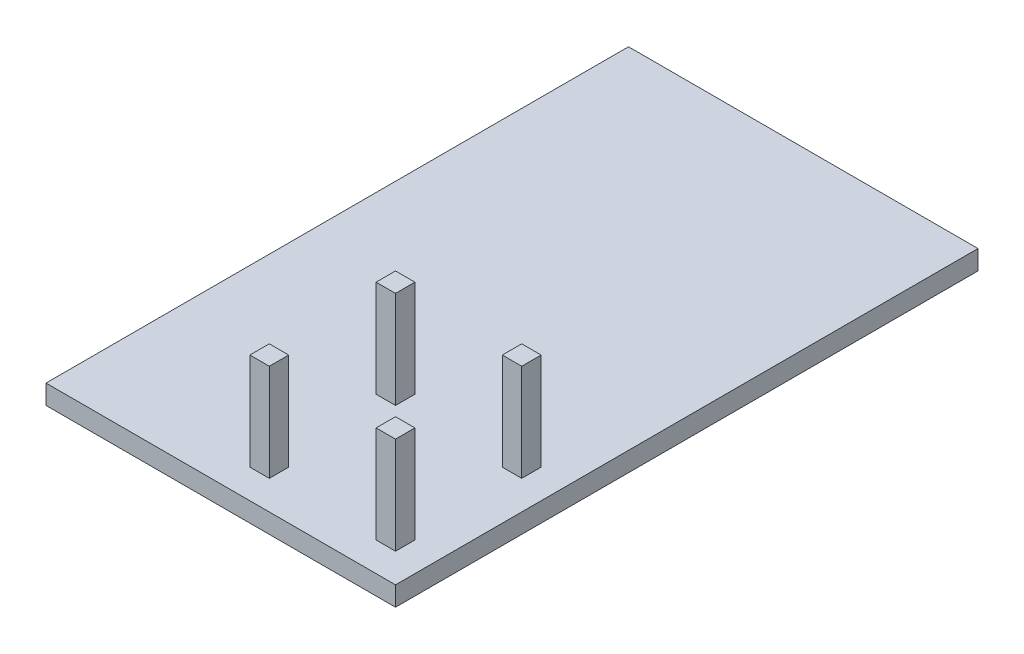
ISO-10303-21;
HEADER;
FILE_DESCRIPTION(('STEP AP214'),'2;1');
FILE_NAME('part.step','',(''),(''),'','','');
FILE_SCHEMA(('AUTOMOTIVE_DESIGN { 1 0 10303 214 1 1 1 1 }'));
ENDSEC;
DATA;
#1=APPLICATION_CONTEXT('core data for automotive mechanical design processes');
#2=APPLICATION_PROTOCOL_DEFINITION('international standard','automotive_design',2000,#1);
#3=PRODUCT_CONTEXT('',#1,'mechanical');
#4=PRODUCT('Part','Part','',(#3));
#5=PRODUCT_RELATED_PRODUCT_CATEGORY('part','',(#4));
#6=PRODUCT_DEFINITION_FORMATION('','',#4);
#7=PRODUCT_DEFINITION_CONTEXT('part definition',#1,'design');
#8=PRODUCT_DEFINITION('design','',#6,#7);
#9=PRODUCT_DEFINITION_SHAPE('','',#8);
#10=(LENGTH_UNIT() NAMED_UNIT(*) SI_UNIT(.MILLI.,.METRE.));
#11=(NAMED_UNIT(*) PLANE_ANGLE_UNIT() SI_UNIT($,.RADIAN.));
#12=(NAMED_UNIT(*) SI_UNIT($,.STERADIAN.) SOLID_ANGLE_UNIT());
#13=UNCERTAINTY_MEASURE_WITH_UNIT(LENGTH_MEASURE(1.E-05),#10,'distance_accuracy_value','');
#14=(GEOMETRIC_REPRESENTATION_CONTEXT(3) GLOBAL_UNCERTAINTY_ASSIGNED_CONTEXT((#13)) GLOBAL_UNIT_ASSIGNED_CONTEXT((#10,
#11,#12)) REPRESENTATION_CONTEXT('',''));
#15=CARTESIAN_POINT('',(0.,0.,0.));
#16=DIRECTION('',(0.,0.,1.));
#17=DIRECTION('',(1.,0.,0.));
#18=AXIS2_PLACEMENT_3D('',#15,#16,#17);
#19=CARTESIAN_POINT('',(0.,10.,0.));
#20=DIRECTION('',(0.,-1.,0.));
#21=DIRECTION('',(0.,0.,-1.));
#22=AXIS2_PLACEMENT_3D('',#19,#20,#21);
#23=PLANE('',#22);
#24=DIRECTION('',(0.,0.,-1.));
#25=VECTOR('',#24,1.);
#26=CARTESIAN_POINT('',(75.,10.,70.));
#27=LINE('',#26,#25);
#28=CARTESIAN_POINT('',(75.,10.,70.));
#29=VERTEX_POINT('',#28);
#30=CARTESIAN_POINT('',(75.,10.,60.));
#31=VERTEX_POINT('',#30);
#32=EDGE_CURVE('E195',#29,#31,#27,.T.);
#33=ORIENTED_EDGE('',*,*,#32,.F.);
#34=DIRECTION('',(1.,0.,0.));
#35=VECTOR('',#34,1.);
#36=CARTESIAN_POINT('',(65.,10.,70.));
#37=LINE('',#36,#35);
#38=CARTESIAN_POINT('',(65.,10.,70.));
#39=VERTEX_POINT('',#38);
#40=EDGE_CURVE('E208',#39,#29,#37,.T.);
#41=ORIENTED_EDGE('',*,*,#40,.F.);
#42=DIRECTION('',(0.,0.,1.));
#43=VECTOR('',#42,1.);
#44=CARTESIAN_POINT('',(65.,10.,60.));
#45=LINE('',#44,#43);
#46=CARTESIAN_POINT('',(65.,10.,60.));
#47=VERTEX_POINT('',#46);
#48=EDGE_CURVE('E217',#47,#39,#45,.T.);
#49=ORIENTED_EDGE('',*,*,#48,.F.);
#50=DIRECTION('',(-1.,0.,0.));
#51=VECTOR('',#50,1.);
#52=CARTESIAN_POINT('',(75.,10.,60.));
#53=LINE('',#52,#51);
#54=EDGE_CURVE('E198',#31,#47,#53,.T.);
#55=ORIENTED_EDGE('',*,*,#54,.F.);
#56=EDGE_LOOP('',(#33,#41,#49,#55));
#57=FACE_BOUND('',#56,.T.);
#58=DIRECTION('',(0.,0.,-1.));
#59=VECTOR('',#58,1.);
#60=CARTESIAN_POINT('',(75.,10.,135.));
#61=LINE('',#60,#59);
#62=CARTESIAN_POINT('',(75.,10.,135.));
#63=VERTEX_POINT('',#62);
#64=CARTESIAN_POINT('',(75.,10.,125.));
#65=VERTEX_POINT('',#64);
#66=EDGE_CURVE('E266',#63,#65,#61,.T.);
#67=ORIENTED_EDGE('',*,*,#66,.F.);
#68=DIRECTION('',(1.,0.,0.));
#69=VECTOR('',#68,1.);
#70=CARTESIAN_POINT('',(75.,10.,135.));
#71=LINE('',#70,#69);
#72=CARTESIAN_POINT('',(65.,10.,135.));
#73=VERTEX_POINT('',#72);
#74=EDGE_CURVE('E271',#73,#63,#71,.T.);
#75=ORIENTED_EDGE('',*,*,#74,.F.);
#76=DIRECTION('',(0.,0.,1.));
#77=VECTOR('',#76,1.);
#78=CARTESIAN_POINT('',(65.,10.,125.));
#79=LINE('',#78,#77);
#80=CARTESIAN_POINT('',(65.,10.,125.));
#81=VERTEX_POINT('',#80);
#82=EDGE_CURVE('E283',#81,#73,#79,.T.);
#83=ORIENTED_EDGE('',*,*,#82,.F.);
#84=DIRECTION('',(-1.,0.,0.));
#85=VECTOR('',#84,1.);
#86=CARTESIAN_POINT('',(65.,10.,125.));
#87=LINE('',#86,#85);
#88=EDGE_CURVE('E280',#65,#81,#87,.T.);
#89=ORIENTED_EDGE('',*,*,#88,.F.);
#90=EDGE_LOOP('',(#67,#75,#83,#89));
#91=FACE_BOUND('',#90,.T.);
#92=DIRECTION('',(0.,0.,-1.));
#93=VECTOR('',#92,1.);
#94=CARTESIAN_POINT('',(90.,10.,150.));
#95=LINE('',#94,#93);
#96=CARTESIAN_POINT('',(90.,10.,150.));
#97=VERTEX_POINT('',#96);
#98=CARTESIAN_POINT('',(90.,10.,-150.));
#99=VERTEX_POINT('',#98);
#100=EDGE_CURVE('E300',#97,#99,#95,.T.);
#101=ORIENTED_EDGE('',*,*,#100,.T.);
#102=DIRECTION('',(-1.,0.,0.));
#103=VECTOR('',#102,1.);
#104=CARTESIAN_POINT('',(-90.,10.,-150.));
#105=LINE('',#104,#103);
#106=CARTESIAN_POINT('',(-90.,10.,-150.));
#107=VERTEX_POINT('',#106);
#108=EDGE_CURVE('E303',#99,#107,#105,.T.);
#109=ORIENTED_EDGE('',*,*,#108,.T.);
#110=DIRECTION('',(0.,0.,1.));
#111=VECTOR('',#110,1.);
#112=CARTESIAN_POINT('',(-90.,10.,150.));
#113=LINE('',#112,#111);
#114=CARTESIAN_POINT('',(-90.,10.,150.));
#115=VERTEX_POINT('',#114);
#116=EDGE_CURVE('E306',#107,#115,#113,.T.);
#117=ORIENTED_EDGE('',*,*,#116,.T.);
#118=DIRECTION('',(1.,0.,0.));
#119=VECTOR('',#118,1.);
#120=CARTESIAN_POINT('',(-90.,10.,150.));
#121=LINE('',#120,#119);
#122=EDGE_CURVE('E308',#115,#97,#121,.T.);
#123=ORIENTED_EDGE('',*,*,#122,.T.);
#124=EDGE_LOOP('',(#101,#109,#117,#123));
#125=FACE_BOUND('',#124,.T.);
#126=DIRECTION('',(0.,0.,1.));
#127=VECTOR('',#126,1.);
#128=CARTESIAN_POINT('',(0.,10.,70.));
#129=LINE('',#128,#127);
#130=CARTESIAN_POINT('',(0.,10.,60.));
#131=VERTEX_POINT('',#130);
#132=CARTESIAN_POINT('',(0.,10.,70.));
#133=VERTEX_POINT('',#132);
#134=EDGE_CURVE('E233',#131,#133,#129,.T.);
#135=ORIENTED_EDGE('',*,*,#134,.F.);
#136=DIRECTION('',(-1.,0.,0.));
#137=VECTOR('',#136,1.);
#138=CARTESIAN_POINT('',(9.99999999999999,10.,60.));
#139=LINE('',#138,#137);
#140=CARTESIAN_POINT('',(9.99999999999999,10.,60.));
#141=VERTEX_POINT('',#140);
#142=EDGE_CURVE('E238',#141,#131,#139,.T.);
#143=ORIENTED_EDGE('',*,*,#142,.F.);
#144=DIRECTION('',(0.,0.,-1.));
#145=VECTOR('',#144,1.);
#146=CARTESIAN_POINT('',(9.99999999999999,10.,70.));
#147=LINE('',#146,#145);
#148=CARTESIAN_POINT('',(9.99999999999999,10.,70.));
#149=VERTEX_POINT('',#148);
#150=EDGE_CURVE('E250',#149,#141,#147,.T.);
#151=ORIENTED_EDGE('',*,*,#150,.F.);
#152=DIRECTION('',(1.,0.,0.));
#153=VECTOR('',#152,1.);
#154=CARTESIAN_POINT('',(0.,10.,70.));
#155=LINE('',#154,#153);
#156=EDGE_CURVE('E247',#133,#149,#155,.T.);
#157=ORIENTED_EDGE('',*,*,#156,.F.);
#158=EDGE_LOOP('',(#135,#143,#151,#157));
#159=FACE_BOUND('',#158,.T.);
#160=DIRECTION('',(1.,0.,0.));
#161=VECTOR('',#160,1.);
#162=CARTESIAN_POINT('',(9.99999999999999,10.,135.));
#163=LINE('',#162,#161);
#164=CARTESIAN_POINT('',(0.,10.,135.));
#165=VERTEX_POINT('',#164);
#166=CARTESIAN_POINT('',(9.99999999999999,10.,135.));
#167=VERTEX_POINT('',#166);
#168=EDGE_CURVE('E194',#165,#167,#163,.T.);
#169=ORIENTED_EDGE('',*,*,#168,.F.);
#170=DIRECTION('',(0.,0.,1.));
#171=VECTOR('',#170,1.);
#172=CARTESIAN_POINT('',(0.,10.,135.));
#173=LINE('',#172,#171);
#174=CARTESIAN_POINT('',(0.,10.,125.));
#175=VERTEX_POINT('',#174);
#176=EDGE_CURVE('E191',#175,#165,#173,.T.);
#177=ORIENTED_EDGE('',*,*,#176,.F.);
#178=DIRECTION('',(-1.,0.,0.));
#179=VECTOR('',#178,1.);
#180=CARTESIAN_POINT('',(0.,10.,125.));
#181=LINE('',#180,#179);
#182=CARTESIAN_POINT('',(9.99999999999999,10.,125.));
#183=VERTEX_POINT('',#182);
#184=EDGE_CURVE('E57',#183,#175,#181,.T.);
#185=ORIENTED_EDGE('',*,*,#184,.F.);
#186=DIRECTION('',(0.,0.,-1.));
#187=VECTOR('',#186,1.);
#188=CARTESIAN_POINT('',(9.99999999999999,10.,135.));
#189=LINE('',#188,#187);
#190=EDGE_CURVE('E52',#167,#183,#189,.T.);
#191=ORIENTED_EDGE('',*,*,#190,.F.);
#192=EDGE_LOOP('',(#169,#177,#185,#191));
#193=FACE_BOUND('',#192,.T.);
#194=ADVANCED_FACE('F37',(#57,#91,#125,#159,#193),#23,.F.);
#195=CARTESIAN_POINT('',(90.,10.,150.));
#196=DIRECTION('',(-1.,0.,0.));
#197=DIRECTION('',(0.,0.,1.));
#198=AXIS2_PLACEMENT_3D('',#195,#196,#197);
#199=PLANE('',#198);
#200=DIRECTION('',(0.,0.,-1.));
#201=VECTOR('',#200,1.);
#202=CARTESIAN_POINT('',(90.,0.,150.));
#203=LINE('',#202,#201);
#204=CARTESIAN_POINT('',(90.,0.,150.));
#205=VERTEX_POINT('',#204);
#206=CARTESIAN_POINT('',(90.,0.,-150.));
#207=VERTEX_POINT('',#206);
#208=EDGE_CURVE('E299',#205,#207,#203,.T.);
#209=ORIENTED_EDGE('',*,*,#208,.T.);
#210=DIRECTION('',(0.,-1.,0.));
#211=VECTOR('',#210,1.);
#212=CARTESIAN_POINT('',(90.,10.,-150.));
#213=LINE('',#212,#211);
#214=EDGE_CURVE('E11',#99,#207,#213,.T.);
#215=ORIENTED_EDGE('',*,*,#214,.F.);
#216=ORIENTED_EDGE('',*,*,#100,.F.);
#217=DIRECTION('',(0.,-1.,0.));
#218=VECTOR('',#217,1.);
#219=CARTESIAN_POINT('',(90.,10.,150.));
#220=LINE('',#219,#218);
#221=EDGE_CURVE('E310',#97,#205,#220,.T.);
#222=ORIENTED_EDGE('',*,*,#221,.T.);
#223=EDGE_LOOP('',(#209,#215,#216,#222));
#224=FACE_BOUND('',#223,.T.);
#225=ADVANCED_FACE('F39',(#224),#199,.F.);
#226=CARTESIAN_POINT('',(-90.,10.,-150.));
#227=DIRECTION('',(0.,0.,1.));
#228=DIRECTION('',(1.,0.,0.));
#229=AXIS2_PLACEMENT_3D('',#226,#227,#228);
#230=PLANE('',#229);
#231=DIRECTION('',(-1.,0.,0.));
#232=VECTOR('',#231,1.);
#233=CARTESIAN_POINT('',(-90.,0.,-150.));
#234=LINE('',#233,#232);
#235=CARTESIAN_POINT('',(-90.,0.,-150.));
#236=VERTEX_POINT('',#235);
#237=EDGE_CURVE('E313',#207,#236,#234,.T.);
#238=ORIENTED_EDGE('',*,*,#237,.T.);
#239=DIRECTION('',(0.,-1.,0.));
#240=VECTOR('',#239,1.);
#241=CARTESIAN_POINT('',(-90.,10.,-150.));
#242=LINE('',#241,#240);
#243=EDGE_CURVE('E45',#107,#236,#242,.T.);
#244=ORIENTED_EDGE('',*,*,#243,.F.);
#245=ORIENTED_EDGE('',*,*,#108,.F.);
#246=ORIENTED_EDGE('',*,*,#214,.T.);
#247=EDGE_LOOP('',(#238,#244,#245,#246));
#248=FACE_BOUND('',#247,.T.);
#249=ADVANCED_FACE('F343',(#248),#230,.F.);
#250=CARTESIAN_POINT('',(-90.,10.,150.));
#251=DIRECTION('',(1.,0.,0.));
#252=DIRECTION('',(0.,0.,-1.));
#253=AXIS2_PLACEMENT_3D('',#250,#251,#252);
#254=PLANE('',#253);
#255=DIRECTION('',(0.,0.,1.));
#256=VECTOR('',#255,1.);
#257=CARTESIAN_POINT('',(-90.,0.,150.));
#258=LINE('',#257,#256);
#259=CARTESIAN_POINT('',(-90.,0.,150.));
#260=VERTEX_POINT('',#259);
#261=EDGE_CURVE('E315',#236,#260,#258,.T.);
#262=ORIENTED_EDGE('',*,*,#261,.T.);
#263=DIRECTION('',(0.,-1.,0.));
#264=VECTOR('',#263,1.);
#265=CARTESIAN_POINT('',(-90.,10.,150.));
#266=LINE('',#265,#264);
#267=EDGE_CURVE('E320',#115,#260,#266,.T.);
#268=ORIENTED_EDGE('',*,*,#267,.F.);
#269=ORIENTED_EDGE('',*,*,#116,.F.);
#270=ORIENTED_EDGE('',*,*,#243,.T.);
#271=EDGE_LOOP('',(#262,#268,#269,#270));
#272=FACE_BOUND('',#271,.T.);
#273=ADVANCED_FACE('F327',(#272),#254,.F.);
#274=CARTESIAN_POINT('',(-90.,10.,150.));
#275=DIRECTION('',(0.,0.,-1.));
#276=DIRECTION('',(-1.,0.,0.));
#277=AXIS2_PLACEMENT_3D('',#274,#275,#276);
#278=PLANE('',#277);
#279=DIRECTION('',(1.,0.,0.));
#280=VECTOR('',#279,1.);
#281=CARTESIAN_POINT('',(-90.,0.,150.));
#282=LINE('',#281,#280);
#283=EDGE_CURVE('E304',#260,#205,#282,.T.);
#284=ORIENTED_EDGE('',*,*,#283,.T.);
#285=ORIENTED_EDGE('',*,*,#221,.F.);
#286=ORIENTED_EDGE('',*,*,#122,.F.);
#287=ORIENTED_EDGE('',*,*,#267,.T.);
#288=EDGE_LOOP('',(#284,#285,#286,#287));
#289=FACE_BOUND('',#288,.T.);
#290=ADVANCED_FACE('F336',(#289),#278,.F.);
#291=CARTESIAN_POINT('',(0.,0.,0.));
#292=DIRECTION('',(0.,-1.,0.));
#293=DIRECTION('',(0.,0.,-1.));
#294=AXIS2_PLACEMENT_3D('',#291,#292,#293);
#295=PLANE('',#294);
#296=ORIENTED_EDGE('',*,*,#208,.F.);
#297=ORIENTED_EDGE('',*,*,#283,.F.);
#298=ORIENTED_EDGE('',*,*,#261,.F.);
#299=ORIENTED_EDGE('',*,*,#237,.F.);
#300=EDGE_LOOP('',(#296,#297,#298,#299));
#301=FACE_BOUND('',#300,.T.);
#302=ADVANCED_FACE('F333',(#301),#295,.T.);
#303=CARTESIAN_POINT('',(75.,60.,135.));
#304=DIRECTION('',(-1.,0.,0.));
#305=DIRECTION('',(0.,0.,1.));
#306=AXIS2_PLACEMENT_3D('',#303,#304,#305);
#307=PLANE('',#306);
#308=ORIENTED_EDGE('',*,*,#66,.T.);
#309=DIRECTION('',(0.,-1.,0.));
#310=VECTOR('',#309,1.);
#311=CARTESIAN_POINT('',(75.,60.,125.));
#312=LINE('',#311,#310);
#313=CARTESIAN_POINT('',(75.,60.,125.));
#314=VERTEX_POINT('',#313);
#315=EDGE_CURVE('E296',#314,#65,#312,.T.);
#316=ORIENTED_EDGE('',*,*,#315,.F.);
#317=DIRECTION('',(0.,0.,-1.));
#318=VECTOR('',#317,1.);
#319=CARTESIAN_POINT('',(75.,60.,135.));
#320=LINE('',#319,#318);
#321=CARTESIAN_POINT('',(75.,60.,135.));
#322=VERTEX_POINT('',#321);
#323=EDGE_CURVE('E267',#322,#314,#320,.T.);
#324=ORIENTED_EDGE('',*,*,#323,.F.);
#325=DIRECTION('',(0.,-1.,0.));
#326=VECTOR('',#325,1.);
#327=CARTESIAN_POINT('',(75.,60.,135.));
#328=LINE('',#327,#326);
#329=EDGE_CURVE('E277',#322,#63,#328,.T.);
#330=ORIENTED_EDGE('',*,*,#329,.T.);
#331=EDGE_LOOP('',(#308,#316,#324,#330));
#332=FACE_BOUND('',#331,.T.);
#333=ADVANCED_FACE('F358',(#332),#307,.F.);
#334=CARTESIAN_POINT('',(65.,60.,125.));
#335=DIRECTION('',(0.,0.,1.));
#336=DIRECTION('',(1.,0.,0.));
#337=AXIS2_PLACEMENT_3D('',#334,#335,#336);
#338=PLANE('',#337);
#339=ORIENTED_EDGE('',*,*,#88,.T.);
#340=DIRECTION('',(0.,-1.,0.));
#341=VECTOR('',#340,1.);
#342=CARTESIAN_POINT('',(65.,60.,125.));
#343=LINE('',#342,#341);
#344=CARTESIAN_POINT('',(65.,60.,125.));
#345=VERTEX_POINT('',#344);
#346=EDGE_CURVE('E293',#345,#81,#343,.T.);
#347=ORIENTED_EDGE('',*,*,#346,.F.);
#348=DIRECTION('',(-1.,0.,0.));
#349=VECTOR('',#348,1.);
#350=CARTESIAN_POINT('',(65.,60.,125.));
#351=LINE('',#350,#349);
#352=EDGE_CURVE('E270',#314,#345,#351,.T.);
#353=ORIENTED_EDGE('',*,*,#352,.F.);
#354=ORIENTED_EDGE('',*,*,#315,.T.);
#355=EDGE_LOOP('',(#339,#347,#353,#354));
#356=FACE_BOUND('',#355,.T.);
#357=ADVANCED_FACE('F377',(#356),#338,.F.);
#358=CARTESIAN_POINT('',(65.,60.,125.));
#359=DIRECTION('',(1.,0.,0.));
#360=DIRECTION('',(0.,0.,-1.));
#361=AXIS2_PLACEMENT_3D('',#358,#359,#360);
#362=PLANE('',#361);
#363=ORIENTED_EDGE('',*,*,#82,.T.);
#364=DIRECTION('',(0.,-1.,0.));
#365=VECTOR('',#364,1.);
#366=CARTESIAN_POINT('',(65.,60.,135.));
#367=LINE('',#366,#365);
#368=CARTESIAN_POINT('',(65.,60.,135.));
#369=VERTEX_POINT('',#368);
#370=EDGE_CURVE('E290',#369,#73,#367,.T.);
#371=ORIENTED_EDGE('',*,*,#370,.F.);
#372=DIRECTION('',(0.,0.,1.));
#373=VECTOR('',#372,1.);
#374=CARTESIAN_POINT('',(65.,60.,125.));
#375=LINE('',#374,#373);
#376=EDGE_CURVE('E273',#345,#369,#375,.T.);
#377=ORIENTED_EDGE('',*,*,#376,.F.);
#378=ORIENTED_EDGE('',*,*,#346,.T.);
#379=EDGE_LOOP('',(#363,#371,#377,#378));
#380=FACE_BOUND('',#379,.T.);
#381=ADVANCED_FACE('F384',(#380),#362,.F.);
#382=CARTESIAN_POINT('',(75.,60.,135.));
#383=DIRECTION('',(0.,0.,-1.));
#384=DIRECTION('',(-1.,0.,0.));
#385=AXIS2_PLACEMENT_3D('',#382,#383,#384);
#386=PLANE('',#385);
#387=ORIENTED_EDGE('',*,*,#74,.T.);
#388=ORIENTED_EDGE('',*,*,#329,.F.);
#389=DIRECTION('',(1.,0.,0.));
#390=VECTOR('',#389,1.);
#391=CARTESIAN_POINT('',(75.,60.,135.));
#392=LINE('',#391,#390);
#393=EDGE_CURVE('E275',#369,#322,#392,.T.);
#394=ORIENTED_EDGE('',*,*,#393,.F.);
#395=ORIENTED_EDGE('',*,*,#370,.T.);
#396=EDGE_LOOP('',(#387,#388,#394,#395));
#397=FACE_BOUND('',#396,.T.);
#398=ADVANCED_FACE('F391',(#397),#386,.F.);
#399=CARTESIAN_POINT('',(0.,60.,0.));
#400=DIRECTION('',(0.,-1.,0.));
#401=DIRECTION('',(0.,0.,-1.));
#402=AXIS2_PLACEMENT_3D('',#399,#400,#401);
#403=PLANE('',#402);
#404=ORIENTED_EDGE('',*,*,#323,.T.);
#405=ORIENTED_EDGE('',*,*,#352,.T.);
#406=ORIENTED_EDGE('',*,*,#376,.T.);
#407=ORIENTED_EDGE('',*,*,#393,.T.);
#408=EDGE_LOOP('',(#404,#405,#406,#407));
#409=FACE_BOUND('',#408,.T.);
#410=ADVANCED_FACE('F399',(#409),#403,.F.);
#411=CARTESIAN_POINT('',(0.,60.,70.));
#412=DIRECTION('',(1.,0.,0.));
#413=DIRECTION('',(0.,0.,-1.));
#414=AXIS2_PLACEMENT_3D('',#411,#412,#413);
#415=PLANE('',#414);
#416=ORIENTED_EDGE('',*,*,#134,.T.);
#417=DIRECTION('',(0.,-1.,0.));
#418=VECTOR('',#417,1.);
#419=CARTESIAN_POINT('',(0.,60.,70.));
#420=LINE('',#419,#418);
#421=CARTESIAN_POINT('',(0.,60.,70.));
#422=VERTEX_POINT('',#421);
#423=EDGE_CURVE('E263',#422,#133,#420,.T.);
#424=ORIENTED_EDGE('',*,*,#423,.F.);
#425=DIRECTION('',(0.,0.,1.));
#426=VECTOR('',#425,1.);
#427=CARTESIAN_POINT('',(0.,60.,70.));
#428=LINE('',#427,#426);
#429=CARTESIAN_POINT('',(0.,60.,60.));
#430=VERTEX_POINT('',#429);
#431=EDGE_CURVE('E234',#430,#422,#428,.T.);
#432=ORIENTED_EDGE('',*,*,#431,.F.);
#433=DIRECTION('',(0.,-1.,0.));
#434=VECTOR('',#433,1.);
#435=CARTESIAN_POINT('',(0.,60.,60.));
#436=LINE('',#435,#434);
#437=EDGE_CURVE('E244',#430,#131,#436,.T.);
#438=ORIENTED_EDGE('',*,*,#437,.T.);
#439=EDGE_LOOP('',(#416,#424,#432,#438));
#440=FACE_BOUND('',#439,.T.);
#441=ADVANCED_FACE('F407',(#440),#415,.F.);
#442=CARTESIAN_POINT('',(0.,60.,70.));
#443=DIRECTION('',(0.,0.,-1.));
#444=DIRECTION('',(-1.,0.,0.));
#445=AXIS2_PLACEMENT_3D('',#442,#443,#444);
#446=PLANE('',#445);
#447=ORIENTED_EDGE('',*,*,#156,.T.);
#448=DIRECTION('',(0.,-1.,0.));
#449=VECTOR('',#448,1.);
#450=CARTESIAN_POINT('',(9.99999999999999,60.,70.));
#451=LINE('',#450,#449);
#452=CARTESIAN_POINT('',(9.99999999999999,60.,70.));
#453=VERTEX_POINT('',#452);
#454=EDGE_CURVE('E260',#453,#149,#451,.T.);
#455=ORIENTED_EDGE('',*,*,#454,.F.);
#456=DIRECTION('',(1.,0.,0.));
#457=VECTOR('',#456,1.);
#458=CARTESIAN_POINT('',(0.,60.,70.));
#459=LINE('',#458,#457);
#460=EDGE_CURVE('E237',#422,#453,#459,.T.);
#461=ORIENTED_EDGE('',*,*,#460,.F.);
#462=ORIENTED_EDGE('',*,*,#423,.T.);
#463=EDGE_LOOP('',(#447,#455,#461,#462));
#464=FACE_BOUND('',#463,.T.);
#465=ADVANCED_FACE('F415',(#464),#446,.F.);
#466=CARTESIAN_POINT('',(9.99999999999999,60.,70.));
#467=DIRECTION('',(-1.,0.,0.));
#468=DIRECTION('',(0.,0.,1.));
#469=AXIS2_PLACEMENT_3D('',#466,#467,#468);
#470=PLANE('',#469);
#471=ORIENTED_EDGE('',*,*,#150,.T.);
#472=DIRECTION('',(0.,-1.,0.));
#473=VECTOR('',#472,1.);
#474=CARTESIAN_POINT('',(9.99999999999999,60.,60.));
#475=LINE('',#474,#473);
#476=CARTESIAN_POINT('',(9.99999999999999,60.,60.));
#477=VERTEX_POINT('',#476);
#478=EDGE_CURVE('E257',#477,#141,#475,.T.);
#479=ORIENTED_EDGE('',*,*,#478,.F.);
#480=DIRECTION('',(0.,0.,-1.));
#481=VECTOR('',#480,1.);
#482=CARTESIAN_POINT('',(9.99999999999999,60.,70.));
#483=LINE('',#482,#481);
#484=EDGE_CURVE('E240',#453,#477,#483,.T.);
#485=ORIENTED_EDGE('',*,*,#484,.F.);
#486=ORIENTED_EDGE('',*,*,#454,.T.);
#487=EDGE_LOOP('',(#471,#479,#485,#486));
#488=FACE_BOUND('',#487,.T.);
#489=ADVANCED_FACE('F423',(#488),#470,.F.);
#490=CARTESIAN_POINT('',(9.99999999999999,60.,60.));
#491=DIRECTION('',(0.,0.,1.));
#492=DIRECTION('',(1.,0.,0.));
#493=AXIS2_PLACEMENT_3D('',#490,#491,#492);
#494=PLANE('',#493);
#495=ORIENTED_EDGE('',*,*,#142,.T.);
#496=ORIENTED_EDGE('',*,*,#437,.F.);
#497=DIRECTION('',(-1.,0.,0.));
#498=VECTOR('',#497,1.);
#499=CARTESIAN_POINT('',(9.99999999999999,60.,60.));
#500=LINE('',#499,#498);
#501=EDGE_CURVE('E242',#477,#430,#500,.T.);
#502=ORIENTED_EDGE('',*,*,#501,.F.);
#503=ORIENTED_EDGE('',*,*,#478,.T.);
#504=EDGE_LOOP('',(#495,#496,#502,#503));
#505=FACE_BOUND('',#504,.T.);
#506=ADVANCED_FACE('F431',(#505),#494,.F.);
#507=CARTESIAN_POINT('',(0.,60.,0.));
#508=DIRECTION('',(0.,1.,0.));
#509=DIRECTION('',(0.,0.,1.));
#510=AXIS2_PLACEMENT_3D('',#507,#508,#509);
#511=PLANE('',#510);
#512=ORIENTED_EDGE('',*,*,#431,.T.);
#513=ORIENTED_EDGE('',*,*,#460,.T.);
#514=ORIENTED_EDGE('',*,*,#484,.T.);
#515=ORIENTED_EDGE('',*,*,#501,.T.);
#516=EDGE_LOOP('',(#512,#513,#514,#515));
#517=FACE_BOUND('',#516,.T.);
#518=ADVANCED_FACE('F439',(#517),#511,.T.);
#519=CARTESIAN_POINT('',(75.,60.,70.));
#520=DIRECTION('',(-1.,0.,0.));
#521=DIRECTION('',(0.,0.,1.));
#522=AXIS2_PLACEMENT_3D('',#519,#520,#521);
#523=PLANE('',#522);
#524=ORIENTED_EDGE('',*,*,#32,.T.);
#525=DIRECTION('',(0.,-1.,0.));
#526=VECTOR('',#525,1.);
#527=CARTESIAN_POINT('',(75.,60.,60.));
#528=LINE('',#527,#526);
#529=CARTESIAN_POINT('',(75.,60.,60.));
#530=VERTEX_POINT('',#529);
#531=EDGE_CURVE('E230',#530,#31,#528,.T.);
#532=ORIENTED_EDGE('',*,*,#531,.F.);
#533=DIRECTION('',(0.,0.,-1.));
#534=VECTOR('',#533,1.);
#535=CARTESIAN_POINT('',(75.,60.,70.));
#536=LINE('',#535,#534);
#537=CARTESIAN_POINT('',(75.,60.,70.));
#538=VERTEX_POINT('',#537);
#539=EDGE_CURVE('E204',#538,#530,#536,.T.);
#540=ORIENTED_EDGE('',*,*,#539,.F.);
#541=DIRECTION('',(0.,-1.,0.));
#542=VECTOR('',#541,1.);
#543=CARTESIAN_POINT('',(75.,60.,70.));
#544=LINE('',#543,#542);
#545=EDGE_CURVE('E213',#538,#29,#544,.T.);
#546=ORIENTED_EDGE('',*,*,#545,.T.);
#547=EDGE_LOOP('',(#524,#532,#540,#546));
#548=FACE_BOUND('',#547,.T.);
#549=ADVANCED_FACE('F447',(#548),#523,.F.);
#550=CARTESIAN_POINT('',(75.,60.,60.));
#551=DIRECTION('',(0.,0.,1.));
#552=DIRECTION('',(1.,0.,0.));
#553=AXIS2_PLACEMENT_3D('',#550,#551,#552);
#554=PLANE('',#553);
#555=ORIENTED_EDGE('',*,*,#54,.T.);
#556=DIRECTION('',(0.,-1.,0.));
#557=VECTOR('',#556,1.);
#558=CARTESIAN_POINT('',(65.,60.,60.));
#559=LINE('',#558,#557);
#560=CARTESIAN_POINT('',(65.,60.,60.));
#561=VERTEX_POINT('',#560);
#562=EDGE_CURVE('E227',#561,#47,#559,.T.);
#563=ORIENTED_EDGE('',*,*,#562,.F.);
#564=DIRECTION('',(-1.,0.,0.));
#565=VECTOR('',#564,1.);
#566=CARTESIAN_POINT('',(75.,60.,60.));
#567=LINE('',#566,#565);
#568=EDGE_CURVE('E207',#530,#561,#567,.T.);
#569=ORIENTED_EDGE('',*,*,#568,.F.);
#570=ORIENTED_EDGE('',*,*,#531,.T.);
#571=EDGE_LOOP('',(#555,#563,#569,#570));
#572=FACE_BOUND('',#571,.T.);
#573=ADVANCED_FACE('F455',(#572),#554,.F.);
#574=CARTESIAN_POINT('',(65.,60.,60.));
#575=DIRECTION('',(1.,0.,0.));
#576=DIRECTION('',(0.,0.,-1.));
#577=AXIS2_PLACEMENT_3D('',#574,#575,#576);
#578=PLANE('',#577);
#579=ORIENTED_EDGE('',*,*,#48,.T.);
#580=DIRECTION('',(0.,-1.,0.));
#581=VECTOR('',#580,1.);
#582=CARTESIAN_POINT('',(65.,60.,70.));
#583=LINE('',#582,#581);
#584=CARTESIAN_POINT('',(65.,60.,70.));
#585=VERTEX_POINT('',#584);
#586=EDGE_CURVE('E224',#585,#39,#583,.T.);
#587=ORIENTED_EDGE('',*,*,#586,.F.);
#588=DIRECTION('',(0.,0.,1.));
#589=VECTOR('',#588,1.);
#590=CARTESIAN_POINT('',(65.,60.,60.));
#591=LINE('',#590,#589);
#592=EDGE_CURVE('E210',#561,#585,#591,.T.);
#593=ORIENTED_EDGE('',*,*,#592,.F.);
#594=ORIENTED_EDGE('',*,*,#562,.T.);
#595=EDGE_LOOP('',(#579,#587,#593,#594));
#596=FACE_BOUND('',#595,.T.);
#597=ADVANCED_FACE('F463',(#596),#578,.F.);
#598=CARTESIAN_POINT('',(65.,60.,70.));
#599=DIRECTION('',(0.,0.,-1.));
#600=DIRECTION('',(-1.,0.,0.));
#601=AXIS2_PLACEMENT_3D('',#598,#599,#600);
#602=PLANE('',#601);
#603=ORIENTED_EDGE('',*,*,#40,.T.);
#604=ORIENTED_EDGE('',*,*,#545,.F.);
#605=DIRECTION('',(1.,0.,0.));
#606=VECTOR('',#605,1.);
#607=CARTESIAN_POINT('',(65.,60.,70.));
#608=LINE('',#607,#606);
#609=EDGE_CURVE('E212',#585,#538,#608,.T.);
#610=ORIENTED_EDGE('',*,*,#609,.F.);
#611=ORIENTED_EDGE('',*,*,#586,.T.);
#612=EDGE_LOOP('',(#603,#604,#610,#611));
#613=FACE_BOUND('',#612,.T.);
#614=ADVANCED_FACE('F471',(#613),#602,.F.);
#615=CARTESIAN_POINT('',(0.,60.,0.));
#616=DIRECTION('',(0.,1.,0.));
#617=DIRECTION('',(0.,0.,1.));
#618=AXIS2_PLACEMENT_3D('',#615,#616,#617);
#619=PLANE('',#618);
#620=ORIENTED_EDGE('',*,*,#539,.T.);
#621=ORIENTED_EDGE('',*,*,#568,.T.);
#622=ORIENTED_EDGE('',*,*,#592,.T.);
#623=ORIENTED_EDGE('',*,*,#609,.T.);
#624=EDGE_LOOP('',(#620,#621,#622,#623));
#625=FACE_BOUND('',#624,.T.);
#626=ADVANCED_FACE('F479',(#625),#619,.T.);
#627=CARTESIAN_POINT('',(9.99999999999999,60.,135.));
#628=DIRECTION('',(0.,0.,-1.));
#629=DIRECTION('',(-1.,0.,0.));
#630=AXIS2_PLACEMENT_3D('',#627,#628,#629);
#631=PLANE('',#630);
#632=ORIENTED_EDGE('',*,*,#168,.T.);
#633=DIRECTION('',(0.,-1.,0.));
#634=VECTOR('',#633,1.);
#635=CARTESIAN_POINT('',(9.99999999999999,60.,135.));
#636=LINE('',#635,#634);
#637=CARTESIAN_POINT('',(9.99999999999999,60.,135.));
#638=VERTEX_POINT('',#637);
#639=EDGE_CURVE('E175',#638,#167,#636,.T.);
#640=ORIENTED_EDGE('',*,*,#639,.F.);
#641=DIRECTION('',(1.,0.,0.));
#642=VECTOR('',#641,1.);
#643=CARTESIAN_POINT('',(9.99999999999999,60.,135.));
#644=LINE('',#643,#642);
#645=CARTESIAN_POINT('',(0.,60.,135.));
#646=VERTEX_POINT('',#645);
#647=EDGE_CURVE('E182',#646,#638,#644,.T.);
#648=ORIENTED_EDGE('',*,*,#647,.F.);
#649=DIRECTION('',(0.,-1.,0.));
#650=VECTOR('',#649,1.);
#651=CARTESIAN_POINT('',(0.,60.,135.));
#652=LINE('',#651,#650);
#653=EDGE_CURVE('E588',#646,#165,#652,.T.);
#654=ORIENTED_EDGE('',*,*,#653,.T.);
#655=EDGE_LOOP('',(#632,#640,#648,#654));
#656=FACE_BOUND('',#655,.T.);
#657=ADVANCED_FACE('F193',(#656),#631,.F.);
#658=CARTESIAN_POINT('',(9.99999999999999,60.,135.));
#659=DIRECTION('',(-1.,0.,0.));
#660=DIRECTION('',(0.,0.,1.));
#661=AXIS2_PLACEMENT_3D('',#658,#659,#660);
#662=PLANE('',#661);
#663=ORIENTED_EDGE('',*,*,#190,.T.);
#664=DIRECTION('',(0.,-1.,0.));
#665=VECTOR('',#664,1.);
#666=CARTESIAN_POINT('',(9.99999999999999,60.,125.));
#667=LINE('',#666,#665);
#668=CARTESIAN_POINT('',(9.99999999999999,60.,125.));
#669=VERTEX_POINT('',#668);
#670=EDGE_CURVE('E178',#669,#183,#667,.T.);
#671=ORIENTED_EDGE('',*,*,#670,.F.);
#672=DIRECTION('',(0.,0.,-1.));
#673=VECTOR('',#672,1.);
#674=CARTESIAN_POINT('',(9.99999999999999,60.,135.));
#675=LINE('',#674,#673);
#676=EDGE_CURVE('E171',#638,#669,#675,.T.);
#677=ORIENTED_EDGE('',*,*,#676,.F.);
#678=ORIENTED_EDGE('',*,*,#639,.T.);
#679=EDGE_LOOP('',(#663,#671,#677,#678));
#680=FACE_BOUND('',#679,.T.);
#681=ADVANCED_FACE('F173',(#680),#662,.F.);
#682=CARTESIAN_POINT('',(0.,60.,125.));
#683=DIRECTION('',(0.,0.,1.));
#684=DIRECTION('',(1.,0.,0.));
#685=AXIS2_PLACEMENT_3D('',#682,#683,#684);
#686=PLANE('',#685);
#687=ORIENTED_EDGE('',*,*,#184,.T.);
#688=DIRECTION('',(0.,-1.,0.));
#689=VECTOR('',#688,1.);
#690=CARTESIAN_POINT('',(0.,60.,125.));
#691=LINE('',#690,#689);
#692=CARTESIAN_POINT('',(0.,60.,125.));
#693=VERTEX_POINT('',#692);
#694=EDGE_CURVE('E200',#693,#175,#691,.T.);
#695=ORIENTED_EDGE('',*,*,#694,.F.);
#696=DIRECTION('',(-1.,0.,0.));
#697=VECTOR('',#696,1.);
#698=CARTESIAN_POINT('',(0.,60.,125.));
#699=LINE('',#698,#697);
#700=EDGE_CURVE('E181',#669,#693,#699,.T.);
#701=ORIENTED_EDGE('',*,*,#700,.F.);
#702=ORIENTED_EDGE('',*,*,#670,.T.);
#703=EDGE_LOOP('',(#687,#695,#701,#702));
#704=FACE_BOUND('',#703,.T.);
#705=ADVANCED_FACE('F500',(#704),#686,.F.);
#706=CARTESIAN_POINT('',(0.,60.,135.));
#707=DIRECTION('',(1.,0.,0.));
#708=DIRECTION('',(0.,0.,-1.));
#709=AXIS2_PLACEMENT_3D('',#706,#707,#708);
#710=PLANE('',#709);
#711=ORIENTED_EDGE('',*,*,#176,.T.);
#712=ORIENTED_EDGE('',*,*,#653,.F.);
#713=DIRECTION('',(0.,0.,1.));
#714=VECTOR('',#713,1.);
#715=CARTESIAN_POINT('',(0.,60.,135.));
#716=LINE('',#715,#714);
#717=EDGE_CURVE('E187',#693,#646,#716,.T.);
#718=ORIENTED_EDGE('',*,*,#717,.F.);
#719=ORIENTED_EDGE('',*,*,#694,.T.);
#720=EDGE_LOOP('',(#711,#712,#718,#719));
#721=FACE_BOUND('',#720,.T.);
#722=ADVANCED_FACE('F507',(#721),#710,.F.);
#723=CARTESIAN_POINT('',(0.,60.,0.));
#724=DIRECTION('',(0.,-1.,0.));
#725=DIRECTION('',(0.,0.,-1.));
#726=AXIS2_PLACEMENT_3D('',#723,#724,#725);
#727=PLANE('',#726);
#728=ORIENTED_EDGE('',*,*,#647,.T.);
#729=ORIENTED_EDGE('',*,*,#676,.T.);
#730=ORIENTED_EDGE('',*,*,#700,.T.);
#731=ORIENTED_EDGE('',*,*,#717,.T.);
#732=EDGE_LOOP('',(#728,#729,#730,#731));
#733=FACE_BOUND('',#732,.T.);
#734=ADVANCED_FACE('F185',(#733),#727,.F.);
#735=CLOSED_SHELL('',(#194,#225,#249,#273,#290,#302,#333,#357,#381,#398,#410,#441,#465,#489,
#506,#518,#549,#573,#597,#614,#626,#657,#681,#705,#722,#734));
#736=MANIFOLD_SOLID_BREP('B2',#735);
#737=ADVANCED_BREP_SHAPE_REPRESENTATION('',(#18,#736),#14);
#738=SHAPE_DEFINITION_REPRESENTATION(#9,#737);
ENDSEC;
END-ISO-10303-21;
